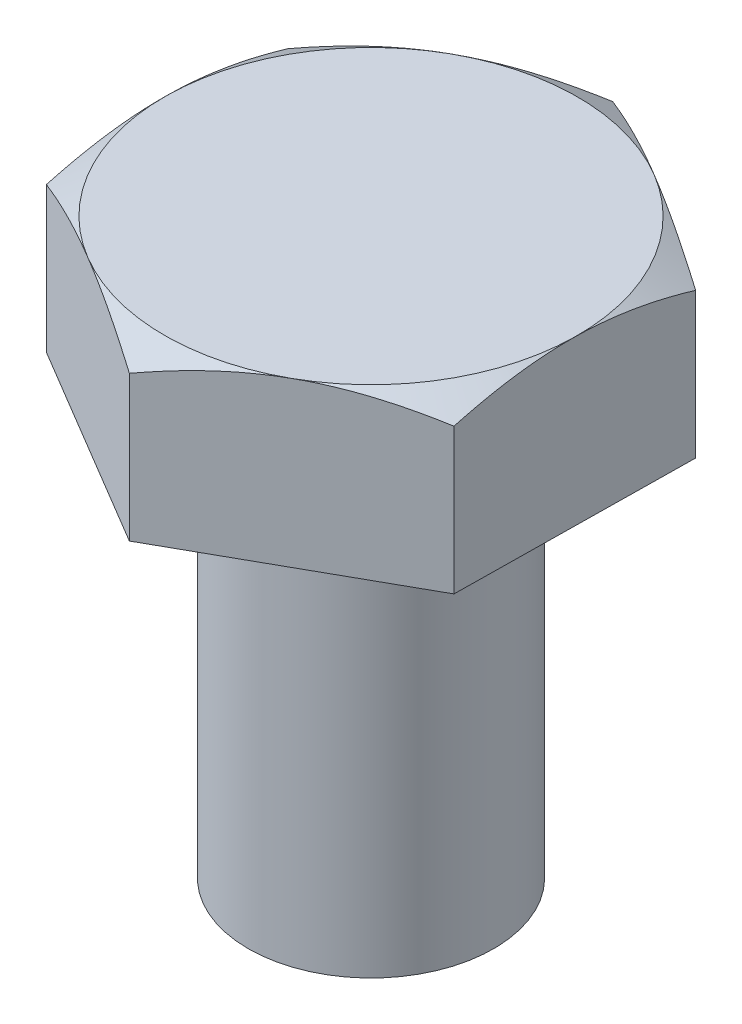
ISO-10303-21;
HEADER;
FILE_DESCRIPTION(('STEP AP214'),'2;1');
FILE_NAME('part.step','',(''),(''),'','','');
FILE_SCHEMA(('AUTOMOTIVE_DESIGN { 1 0 10303 214 1 1 1 1 }'));
ENDSEC;
DATA;
#1=APPLICATION_CONTEXT('core data for automotive mechanical design processes');
#2=APPLICATION_PROTOCOL_DEFINITION('international standard','automotive_design',2000,#1);
#3=PRODUCT_CONTEXT('',#1,'mechanical');
#4=PRODUCT('Part','Part','',(#3));
#5=PRODUCT_RELATED_PRODUCT_CATEGORY('part','',(#4));
#6=PRODUCT_DEFINITION_FORMATION('','',#4);
#7=PRODUCT_DEFINITION_CONTEXT('part definition',#1,'design');
#8=PRODUCT_DEFINITION('design','',#6,#7);
#9=PRODUCT_DEFINITION_SHAPE('','',#8);
#10=(LENGTH_UNIT() NAMED_UNIT(*) SI_UNIT(.MILLI.,.METRE.));
#11=(NAMED_UNIT(*) PLANE_ANGLE_UNIT() SI_UNIT($,.RADIAN.));
#12=(NAMED_UNIT(*) SI_UNIT($,.STERADIAN.) SOLID_ANGLE_UNIT());
#13=UNCERTAINTY_MEASURE_WITH_UNIT(LENGTH_MEASURE(1.E-05),#10,'distance_accuracy_value','');
#14=(GEOMETRIC_REPRESENTATION_CONTEXT(3) GLOBAL_UNCERTAINTY_ASSIGNED_CONTEXT((#13)) GLOBAL_UNIT_ASSIGNED_CONTEXT((#10,
#11,#12)) REPRESENTATION_CONTEXT('',''));
#15=CARTESIAN_POINT('',(0.,0.,0.));
#16=DIRECTION('',(0.,0.,1.));
#17=DIRECTION('',(1.,0.,0.));
#18=AXIS2_PLACEMENT_3D('',#15,#16,#17);
#19=CARTESIAN_POINT('',(5.00722219873248,4.,2.97979122709562));
#20=DIRECTION('',(-0.999912762362187,0.,-0.0132086208674446));
#21=DIRECTION('',(-0.0132086208674446,0.,0.999912762362187));
#22=AXIS2_PLACEMENT_3D('',#19,#20,#21);
#23=PLANE('',#22);
#24=CARTESIAN_POINT('',(5.00721955677783,3.54923882725601,2.97999122709562));
#25=CARTESIAN_POINT('',(5.0106018713427,3.62317625761294,2.72394485149891));
#26=CARTESIAN_POINT('',(5.01401311494337,3.6904256384554,2.46570850373315));
#27=CARTESIAN_POINT('',(5.02089467007304,3.80780967223275,1.94476427586024));
#28=CARTESIAN_POINT('',(5.02436510386321,3.85790280244813,1.68204714039622));
#29=CARTESIAN_POINT('',(5.03126349109287,3.93586600732761,1.15982869686023));
#30=CARTESIAN_POINT('',(5.03469037024859,3.96425538917167,0.900408713709201));
#31=CARTESIAN_POINT('',(5.03984274276313,3.98971237358388,0.510366249364661));
#32=CARTESIAN_POINT('',(5.04156137554895,3.99534492916305,0.380263124019757));
#33=CARTESIAN_POINT('',(5.04500022916478,4.00080530244156,0.119936655959088));
#34=CARTESIAN_POINT('',(5.04672044994411,4.00063329945253,-0.0102866829188294));
#35=CARTESIAN_POINT('',(5.0514333173754,3.9921736525103,-0.367057941565455));
#36=CARTESIAN_POINT('',(5.05442440222253,3.97796744660525,-0.593487630324349));
#37=CARTESIAN_POINT('',(5.06038672049818,3.9329204566082,-1.04484422515133));
#38=CARTESIAN_POINT('',(5.06335793297095,3.90206427548076,-1.26976954483678));
#39=CARTESIAN_POINT('',(5.06933226283884,3.82493213650279,-1.72203543553117));
#40=CARTESIAN_POINT('',(5.07233462626794,3.77832935873631,-1.94931893016198));
#41=CARTESIAN_POINT('',(5.07829457835972,3.67255974721504,-2.40049640125811));
#42=CARTESIAN_POINT('',(5.08125224335487,3.61341775968805,-2.62439615620808));
#43=CARTESIAN_POINT('',(5.08418864195971,3.54923882725601,-2.84668601294789));
#44=B_SPLINE_CURVE_WITH_KNOTS('',3,(#24,#25,#26,#27,#28,#29,#30,#31,#32,#33,#34,#35,#36,#37,#38,
#39,#40,#41,#42,#43),.UNSPECIFIED.,.F.,.F.,(4,2,2,2,2,2,2,2,2,4),(0.,0.799867967077852,
1.60165837020833,2.38360560899009,2.77420178768719,3.16478590028611,3.84475883245437,
4.52536164872997,5.22105970461848,5.91539191921314),.UNSPECIFIED.);
#45=CARTESIAN_POINT('',(5.00722219873248,3.54929656880656,2.97979122709562));
#46=VERTEX_POINT('',#45);
#47=CARTESIAN_POINT('',(5.04570409936877,4.,0.0666526070738682));
#48=VERTEX_POINT('',#47);
#49=EDGE_CURVE('E131',#46,#48,#44,.T.);
#50=ORIENTED_EDGE('',*,*,#49,.F.);
#51=DIRECTION('',(0.,-1.,0.));
#52=VECTOR('',#51,1.);
#53=CARTESIAN_POINT('',(5.00722219873248,4.,2.97979122709562));
#54=LINE('',#53,#52);
#55=CARTESIAN_POINT('',(5.00722219873248,0.,2.97979122709562));
#56=VERTEX_POINT('',#55);
#57=EDGE_CURVE('E80',#46,#56,#54,.T.);
#58=ORIENTED_EDGE('',*,*,#57,.T.);
#59=DIRECTION('',(0.0132086208674446,0.,-0.999912762362187));
#60=VECTOR('',#59,1.);
#61=CARTESIAN_POINT('',(5.00722219873248,0.,2.97979122709562));
#62=LINE('',#61,#60);
#63=CARTESIAN_POINT('',(5.08418600000506,0.,-2.84648601294789));
#64=VERTEX_POINT('',#63);
#65=EDGE_CURVE('E138',#56,#64,#62,.T.);
#66=ORIENTED_EDGE('',*,*,#65,.T.);
#67=DIRECTION('',(0.,-1.,0.));
#68=VECTOR('',#67,1.);
#69=CARTESIAN_POINT('',(5.08418600000506,4.,-2.84648601294789));
#70=LINE('',#69,#68);
#71=CARTESIAN_POINT('',(5.08418600000506,3.54929656880656,-2.84648601294789));
#72=VERTEX_POINT('',#71);
#73=EDGE_CURVE('E151',#72,#64,#70,.T.);
#74=ORIENTED_EDGE('',*,*,#73,.F.);
#75=EDGE_CURVE('E139',#48,#72,#44,.T.);
#76=ORIENTED_EDGE('',*,*,#75,.F.);
#77=EDGE_LOOP('',(#50,#58,#66,#74,#76));
#78=FACE_BOUND('',#77,.T.);
#79=ADVANCED_FACE('F57',(#78),#23,.F.);
#80=CARTESIAN_POINT('',(5.08418600000506,4.,-2.84648601294789));
#81=DIRECTION('',(-0.511395382401258,0.,0.859345543340204));
#82=DIRECTION('',(0.859345543340204,0.,0.511395382401258));
#83=AXIS2_PLACEMENT_3D('',#80,#81,#82);
#84=PLANE('',#83);
#85=CARTESIAN_POINT('',(5.08438600000505,3.54922938191429,-2.84636699321563));
#86=CARTESIAN_POINT('',(4.86433401697332,3.62316758810579,-2.97731963372536));
#87=CARTESIAN_POINT('',(4.64239992389016,3.69041779288756,-3.10939231540704));
#88=CARTESIAN_POINT('',(4.19468876414299,3.8078035367464,-3.37582462720362));
#89=CARTESIAN_POINT('',(3.96890374293109,3.85789755202862,-3.51018899105932));
#90=CARTESIAN_POINT('',(3.52009746927582,3.93586250686594,-3.77727300367653));
#91=CARTESIAN_POINT('',(3.29714611123834,3.96425275893736,-3.90995105837067));
#92=CARTESIAN_POINT('',(2.96193481654687,3.98971100457903,-4.1094348510807));
#93=CARTESIAN_POINT('',(2.85012124936968,3.99534397306831,-4.17597495521852));
#94=CARTESIAN_POINT('',(2.62639078218027,4.00080514747322,-4.30911665672595));
#95=CARTESIAN_POINT('',(2.51447388546661,4.00063353268802,-4.37571825213259));
#96=CARTESIAN_POINT('',(2.20785288988493,3.99217479922327,-4.55818799611736));
#97=CARTESIAN_POINT('',(2.01325039148761,3.9779687507373,-4.67399568239141));
#98=CARTESIAN_POINT('',(1.62533695142715,3.93292133513721,-4.90484245125603));
#99=CARTESIAN_POINT('',(1.43202737326934,3.90206456929602,-5.01988072242643));
#100=CARTESIAN_POINT('',(1.04333238172182,3.82493060521689,-5.25119259153471));
#101=CARTESIAN_POINT('',(0.847996024613632,3.77832656358658,-5.36743699614515));
#102=CARTESIAN_POINT('',(0.460236476354764,3.67255394409794,-5.59819218420467));
#103=CARTESIAN_POINT('',(0.267808318546457,3.61341021485302,-5.71270592330507));
#104=CARTESIAN_POINT('',(0.0767638012725782,3.54922938191429,-5.82639625977576));
#105=B_SPLINE_CURVE_WITH_KNOTS('',3,(#85,#86,#87,#88,#89,#90,#91,#92,#93,#94,#95,#96,#97,#98,
#99,#100,#101,#102,#103,#104),.UNSPECIFIED.,.F.,.F.,(4,2,2,2,2,2,2,2,2,4),(0.,0.799870207319984,
1.6016629120415,2.38361217700529,2.77420935673546,3.16479447122592,3.8447818822245,
4.5253992319138,5.2211125902274,5.91545999872994),.UNSPECIFIED.);
#106=CARTESIAN_POINT('',(2.58057490063882,4.,-4.3363816264957));
#107=VERTEX_POINT('',#106);
#108=EDGE_CURVE('E144',#72,#107,#105,.T.);
#109=ORIENTED_EDGE('',*,*,#108,.F.);
#110=ORIENTED_EDGE('',*,*,#73,.T.);
#111=DIRECTION('',(-0.859345543340204,0.,-0.511395382401258));
#112=VECTOR('',#111,1.);
#113=CARTESIAN_POINT('',(5.08418600000506,0.,-2.84648601294789));
#114=LINE('',#113,#112);
#115=CARTESIAN_POINT('',(0.0769638012725778,0.,-5.82627724004351));
#116=VERTEX_POINT('',#115);
#117=EDGE_CURVE('E266',#64,#116,#114,.T.);
#118=ORIENTED_EDGE('',*,*,#117,.T.);
#119=DIRECTION('',(0.,-1.,0.));
#120=VECTOR('',#119,1.);
#121=CARTESIAN_POINT('',(0.0769638012725778,4.,-5.82627724004351));
#122=LINE('',#121,#120);
#123=CARTESIAN_POINT('',(0.0769638012725779,3.54929656880656,-5.82627724004351));
#124=VERTEX_POINT('',#123);
#125=EDGE_CURVE('E214',#124,#116,#122,.T.);
#126=ORIENTED_EDGE('',*,*,#125,.F.);
#127=EDGE_CURVE('E152',#107,#124,#105,.T.);
#128=ORIENTED_EDGE('',*,*,#127,.F.);
#129=EDGE_LOOP('',(#109,#110,#118,#126,#128));
#130=FACE_BOUND('',#129,.T.);
#131=ADVANCED_FACE('F202',(#130),#84,.F.);
#132=CARTESIAN_POINT('',(0.0769638012725778,4.,-5.82627724004351));
#133=DIRECTION('',(0.488517379960929,0.,0.872554164207649));
#134=DIRECTION('',(0.872554164207649,0.,-0.488517379960929));
#135=AXIS2_PLACEMENT_3D('',#132,#133,#134);
#136=PLANE('',#135);
#137=CARTESIAN_POINT('',(0.077163801272578,3.54923039901146,-5.82638921415354));
#138=CARTESIAN_POINT('',(-0.146270451736622,3.62316852165958,-5.70129495599628));
#139=CARTESIAN_POINT('',(-0.371615743547656,3.69041863771798,-5.57513076349366));
#140=CARTESIAN_POINT('',(-0.826208364267812,3.80780419743189,-5.32061774283156));
#141=CARTESIAN_POINT('',(-1.0554637699574,3.85789811740837,-5.19226439272056));
#142=CARTESIAN_POINT('',(-1.51116833416514,3.93586288380672,-4.93712882764632));
#143=CARTESIAN_POINT('',(-1.73754652419101,3.96425304217028,-4.8103863458519));
#144=CARTESIAN_POINT('',(-2.07791011638596,3.98971115200013,-4.61982679423465));
#145=CARTESIAN_POINT('',(-2.19144229079848,3.99534407602637,-4.55626347328525));
#146=CARTESIAN_POINT('',(-2.41861155904063,4.00080516416427,-4.42907809009465));
#147=CARTESIAN_POINT('',(-2.53224864952103,4.00063350757643,-4.3654560297286));
#148=CARTESIAN_POINT('',(-2.84358209382204,3.99217467574521,-4.19114960298402));
#149=CARTESIAN_POINT('',(-3.04117528445698,3.97796861030707,-4.08052299463501));
#150=CARTESIAN_POINT('',(-3.43505026081183,3.93292124053565,-3.86000399492824));
#151=CARTESIAN_POINT('',(-3.6313306620834,3.90206453765746,-3.75011237868234));
#152=CARTESIAN_POINT('',(-4.02599919362766,3.8249307701092,-3.5291490907951));
#153=CARTESIAN_POINT('',(-4.22433751399779,3.7783268645748,-3.4181053062513));
#154=CARTESIAN_POINT('',(-4.61805622759276,3.67255456899146,-3.19767379346188));
#155=CARTESIAN_POINT('',(-4.81344166375983,3.61341102729903,-3.08828324182141));
#156=CARTESIAN_POINT('',(-5.00742219873248,3.54923039901146,-2.97967925298559));
#157=B_SPLINE_CURVE_WITH_KNOTS('',3,(#137,#138,#139,#140,#141,#142,#143,#144,#145,#146,#147,
#148,#149,#150,#151,#152,#153,#154,#155,#156),.UNSPECIFIED.,.F.,.F.,(4,2,2,2,2,2,2,2,2,4),(0.,
0.799869966085366,1.60166242296607,2.38361146974568,2.77420854168219,3.16479354828656,
3.84477940017653,4.52539518487944,5.22110689539691,5.91545266778893),.UNSPECIFIED.);
#158=CARTESIAN_POINT('',(-2.46512919872995,4.,-4.40303423356957));
#159=VERTEX_POINT('',#158);
#160=EDGE_CURVE('E196',#124,#159,#157,.T.);
#161=ORIENTED_EDGE('',*,*,#160,.F.);
#162=ORIENTED_EDGE('',*,*,#125,.T.);
#163=DIRECTION('',(-0.872554164207649,0.,0.488517379960929));
#164=VECTOR('',#163,1.);
#165=CARTESIAN_POINT('',(0.0769638012725778,0.,-5.82627724004351));
#166=LINE('',#165,#164);
#167=CARTESIAN_POINT('',(-5.00722219873248,0.,-2.97979122709562));
#168=VERTEX_POINT('',#167);
#169=EDGE_CURVE('E232',#116,#168,#166,.T.);
#170=ORIENTED_EDGE('',*,*,#169,.T.);
#171=DIRECTION('',(0.,-1.,0.));
#172=VECTOR('',#171,1.);
#173=CARTESIAN_POINT('',(-5.00722219873248,4.,-2.97979122709562));
#174=LINE('',#173,#172);
#175=CARTESIAN_POINT('',(-5.00722219873248,3.54929656880656,-2.97979122709562));
#176=VERTEX_POINT('',#175);
#177=EDGE_CURVE('E230',#176,#168,#174,.T.);
#178=ORIENTED_EDGE('',*,*,#177,.F.);
#179=EDGE_CURVE('E191',#159,#176,#157,.T.);
#180=ORIENTED_EDGE('',*,*,#179,.F.);
#181=EDGE_LOOP('',(#161,#162,#170,#178,#180));
#182=FACE_BOUND('',#181,.T.);
#183=ADVANCED_FACE('F198',(#182),#136,.F.);
#184=CARTESIAN_POINT('',(-5.00722219873248,4.,-2.97979122709562));
#185=DIRECTION('',(0.999912762362187,0.,0.0132086208674447));
#186=DIRECTION('',(0.0132086208674447,0.,-0.999912762362187));
#187=AXIS2_PLACEMENT_3D('',#184,#185,#186);
#188=PLANE('',#187);
#189=CARTESIAN_POINT('',(-5.00721955677782,3.54923882725601,-2.97999122709563));
#190=CARTESIAN_POINT('',(-5.0106018713427,3.62317625761294,-2.72394485149892));
#191=CARTESIAN_POINT('',(-5.01401311494336,3.6904256384554,-2.46570850373315));
#192=CARTESIAN_POINT('',(-5.02089467007303,3.80780967223275,-1.94476427586024));
#193=CARTESIAN_POINT('',(-5.02436510386321,3.85790280244814,-1.68204714039622));
#194=CARTESIAN_POINT('',(-5.03126349109287,3.93586600732761,-1.15982869686023));
#195=CARTESIAN_POINT('',(-5.03469037024859,3.96425538917167,-0.900408713709202));
#196=CARTESIAN_POINT('',(-5.03984274276313,3.98971237358389,-0.510366249364662));
#197=CARTESIAN_POINT('',(-5.04156137554894,3.99534492916305,-0.380263124019759));
#198=CARTESIAN_POINT('',(-5.04500022916478,4.00080530244156,-0.119936655959089));
#199=CARTESIAN_POINT('',(-5.04672044994411,4.00063329945253,0.0102866829188279));
#200=CARTESIAN_POINT('',(-5.0514333173754,3.9921736525103,0.367057941565454));
#201=CARTESIAN_POINT('',(-5.05442440222252,3.97796744660525,0.593487630324348));
#202=CARTESIAN_POINT('',(-5.06038672049818,3.9329204566082,1.04484422515133));
#203=CARTESIAN_POINT('',(-5.06335793297095,3.90206427548077,1.26976954483678));
#204=CARTESIAN_POINT('',(-5.06933226283883,3.82493213650279,1.72203543553117));
#205=CARTESIAN_POINT('',(-5.07233462626793,3.77832935873631,1.94931893016198));
#206=CARTESIAN_POINT('',(-5.07829457835972,3.67255974721504,2.40049640125811));
#207=CARTESIAN_POINT('',(-5.08125224335487,3.61341775968805,2.62439615620808));
#208=CARTESIAN_POINT('',(-5.08418864195971,3.54923882725601,2.84668601294789));
#209=B_SPLINE_CURVE_WITH_KNOTS('',3,(#189,#190,#191,#192,#193,#194,#195,#196,#197,#198,#199,
#200,#201,#202,#203,#204,#205,#206,#207,#208),.UNSPECIFIED.,.F.,.F.,(4,2,2,2,2,2,2,2,2,4),(0.,
0.799867967077851,1.60165837020833,2.38360560899009,2.77420178768719,3.16478590028611,
3.84475883245437,4.52536164872997,5.22105970461848,5.91539191921314),.UNSPECIFIED.);
#210=CARTESIAN_POINT('',(-5.04570409936877,4.,-0.0666526070738689));
#211=VERTEX_POINT('',#210);
#212=EDGE_CURVE('E197',#176,#211,#209,.T.);
#213=ORIENTED_EDGE('',*,*,#212,.F.);
#214=ORIENTED_EDGE('',*,*,#177,.T.);
#215=DIRECTION('',(-0.0132086208674447,0.,0.999912762362187));
#216=VECTOR('',#215,1.);
#217=CARTESIAN_POINT('',(-5.00722219873248,0.,-2.97979122709562));
#218=LINE('',#217,#216);
#219=CARTESIAN_POINT('',(-5.08418600000505,0.,2.84648601294789));
#220=VERTEX_POINT('',#219);
#221=EDGE_CURVE('E264',#168,#220,#218,.T.);
#222=ORIENTED_EDGE('',*,*,#221,.T.);
#223=DIRECTION('',(0.,-1.,0.));
#224=VECTOR('',#223,1.);
#225=CARTESIAN_POINT('',(-5.08418600000505,4.,2.84648601294789));
#226=LINE('',#225,#224);
#227=CARTESIAN_POINT('',(-5.08418600000505,3.54929656880656,2.84648601294789));
#228=VERTEX_POINT('',#227);
#229=EDGE_CURVE('E236',#228,#220,#226,.T.);
#230=ORIENTED_EDGE('',*,*,#229,.F.);
#231=EDGE_CURVE('E186',#211,#228,#209,.T.);
#232=ORIENTED_EDGE('',*,*,#231,.F.);
#233=EDGE_LOOP('',(#213,#214,#222,#230,#232));
#234=FACE_BOUND('',#233,.T.);
#235=ADVANCED_FACE('F201',(#234),#188,.F.);
#236=CARTESIAN_POINT('',(-5.08418600000505,4.,2.84648601294789));
#237=DIRECTION('',(0.511395382401258,0.,-0.859345543340205));
#238=DIRECTION('',(-0.859345543340204,0.,-0.511395382401258));
#239=AXIS2_PLACEMENT_3D('',#236,#237,#238);
#240=PLANE('',#239);
#241=CARTESIAN_POINT('',(-5.08438600000505,3.54922938191429,2.84636699321563));
#242=CARTESIAN_POINT('',(-4.86433401697332,3.62316758810579,2.97731963372536));
#243=CARTESIAN_POINT('',(-4.64239992389016,3.69041779288756,3.10939231540704));
#244=CARTESIAN_POINT('',(-4.19468876414299,3.8078035367464,3.37582462720362));
#245=CARTESIAN_POINT('',(-3.96890374293108,3.85789755202862,3.51018899105932));
#246=CARTESIAN_POINT('',(-3.52009746927582,3.93586250686594,3.77727300367653));
#247=CARTESIAN_POINT('',(-3.29714611123834,3.96425275893736,3.90995105837067));
#248=CARTESIAN_POINT('',(-2.96193481654687,3.98971100457903,4.1094348510807));
#249=CARTESIAN_POINT('',(-2.85012124936967,3.99534397306831,4.17597495521852));
#250=CARTESIAN_POINT('',(-2.62639078218027,4.00080514747322,4.30911665672595));
#251=CARTESIAN_POINT('',(-2.51447388546661,4.00063353268802,4.37571825213259));
#252=CARTESIAN_POINT('',(-2.20785288988493,3.99217479922327,4.55818799611736));
#253=CARTESIAN_POINT('',(-2.01325039148761,3.9779687507373,4.67399568239141));
#254=CARTESIAN_POINT('',(-1.62533695142715,3.93292133513721,4.90484245125604));
#255=CARTESIAN_POINT('',(-1.43202737326934,3.90206456929602,5.01988072242643));
#256=CARTESIAN_POINT('',(-1.04333238172182,3.82493060521689,5.25119259153471));
#257=CARTESIAN_POINT('',(-0.847996024613629,3.77832656358658,5.36743699614515));
#258=CARTESIAN_POINT('',(-0.46023647635476,3.67255394409794,5.59819218420467));
#259=CARTESIAN_POINT('',(-0.267808318546453,3.61341021485302,5.71270592330507));
#260=CARTESIAN_POINT('',(-0.0767638012725743,3.54922938191429,5.82639625977576));
#261=B_SPLINE_CURVE_WITH_KNOTS('',3,(#241,#242,#243,#244,#245,#246,#247,#248,#249,#250,#251,
#252,#253,#254,#255,#256,#257,#258,#259,#260),.UNSPECIFIED.,.F.,.F.,(4,2,2,2,2,2,2,2,2,4),(0.,
0.799870207319983,1.6016629120415,2.38361217700529,2.77420935673546,3.16479447122592,
3.84478188222451,4.5253992319138,5.2211125902274,5.91545999872994),.UNSPECIFIED.);
#262=CARTESIAN_POINT('',(-2.58057490063882,4.,4.3363816264957));
#263=VERTEX_POINT('',#262);
#264=EDGE_CURVE('E248',#228,#263,#261,.T.);
#265=ORIENTED_EDGE('',*,*,#264,.F.);
#266=ORIENTED_EDGE('',*,*,#229,.T.);
#267=DIRECTION('',(0.859345543340204,0.,0.511395382401258));
#268=VECTOR('',#267,1.);
#269=CARTESIAN_POINT('',(-5.08418600000505,0.,2.84648601294789));
#270=LINE('',#269,#268);
#271=CARTESIAN_POINT('',(-0.076963801272574,0.,5.82627724004351));
#272=VERTEX_POINT('',#271);
#273=EDGE_CURVE('E260',#220,#272,#270,.T.);
#274=ORIENTED_EDGE('',*,*,#273,.T.);
#275=DIRECTION('',(0.,-1.,0.));
#276=VECTOR('',#275,1.);
#277=CARTESIAN_POINT('',(-0.076963801272574,4.,5.82627724004351));
#278=LINE('',#277,#276);
#279=CARTESIAN_POINT('',(-0.076963801272574,3.54929656880656,5.82627724004351));
#280=VERTEX_POINT('',#279);
#281=EDGE_CURVE('E239',#280,#272,#278,.T.);
#282=ORIENTED_EDGE('',*,*,#281,.F.);
#283=EDGE_CURVE('E180',#263,#280,#261,.T.);
#284=ORIENTED_EDGE('',*,*,#283,.F.);
#285=EDGE_LOOP('',(#265,#266,#274,#282,#284));
#286=FACE_BOUND('',#285,.T.);
#287=ADVANCED_FACE('F247',(#286),#240,.F.);
#288=CARTESIAN_POINT('',(-0.076963801272574,4.,5.82627724004351));
#289=DIRECTION('',(-0.488517379960929,0.,-0.872554164207649));
#290=DIRECTION('',(-0.872554164207649,0.,0.488517379960929));
#291=AXIS2_PLACEMENT_3D('',#288,#289,#290);
#292=PLANE('',#291);
#293=CARTESIAN_POINT('',(-0.0771638012725741,3.54923039901146,5.82638921415354));
#294=CARTESIAN_POINT('',(0.146270451736626,3.62316852165958,5.70129495599628));
#295=CARTESIAN_POINT('',(0.37161574354766,3.69041863771797,5.57513076349366));
#296=CARTESIAN_POINT('',(0.826208364267817,3.80780419743189,5.32061774283156));
#297=CARTESIAN_POINT('',(1.0554637699574,3.85789811740837,5.19226439272056));
#298=CARTESIAN_POINT('',(1.51116833416515,3.93586288380672,4.93712882764632));
#299=CARTESIAN_POINT('',(1.73754652419101,3.96425304217028,4.8103863458519));
#300=CARTESIAN_POINT('',(2.07791011638596,3.98971115200013,4.61982679423465));
#301=CARTESIAN_POINT('',(2.19144229079848,3.99534407602637,4.55626347328525));
#302=CARTESIAN_POINT('',(2.41861155904064,4.00080516416427,4.42907809009465));
#303=CARTESIAN_POINT('',(2.53224864952104,4.00063350757643,4.3654560297286));
#304=CARTESIAN_POINT('',(2.84358209382205,3.99217467574521,4.19114960298402));
#305=CARTESIAN_POINT('',(3.04117528445698,3.97796861030707,4.08052299463501));
#306=CARTESIAN_POINT('',(3.43505026081183,3.93292124053565,3.86000399492824));
#307=CARTESIAN_POINT('',(3.6313306620834,3.90206453765746,3.75011237868234));
#308=CARTESIAN_POINT('',(4.02599919362766,3.8249307701092,3.5291490907951));
#309=CARTESIAN_POINT('',(4.22433751399779,3.7783268645748,3.4181053062513));
#310=CARTESIAN_POINT('',(4.61805622759276,3.67255456899146,3.19767379346188));
#311=CARTESIAN_POINT('',(4.81344166375983,3.61341102729903,3.08828324182141));
#312=CARTESIAN_POINT('',(5.00742219873248,3.54923039901146,2.97967925298559));
#313=B_SPLINE_CURVE_WITH_KNOTS('',3,(#293,#294,#295,#296,#297,#298,#299,#300,#301,#302,#303,
#304,#305,#306,#307,#308,#309,#310,#311,#312),.UNSPECIFIED.,.F.,.F.,(4,2,2,2,2,2,2,2,2,4),(0.,
0.799869966085366,1.60166242296607,2.38361146974568,2.77420854168219,3.16479354828656,
3.84477940017653,4.52539518487943,5.22110689539691,5.91545266778893),.UNSPECIFIED.);
#314=CARTESIAN_POINT('',(2.46512919872995,4.,4.40303423356957));
#315=VERTEX_POINT('',#314);
#316=EDGE_CURVE('E253',#280,#315,#313,.T.);
#317=ORIENTED_EDGE('',*,*,#316,.F.);
#318=ORIENTED_EDGE('',*,*,#281,.T.);
#319=DIRECTION('',(0.872554164207649,0.,-0.488517379960929));
#320=VECTOR('',#319,1.);
#321=CARTESIAN_POINT('',(-0.076963801272574,0.,5.82627724004351));
#322=LINE('',#321,#320);
#323=EDGE_CURVE('E257',#272,#56,#322,.T.);
#324=ORIENTED_EDGE('',*,*,#323,.T.);
#325=ORIENTED_EDGE('',*,*,#57,.F.);
#326=EDGE_CURVE('E136',#315,#46,#313,.T.);
#327=ORIENTED_EDGE('',*,*,#326,.F.);
#328=EDGE_LOOP('',(#317,#318,#324,#325,#327));
#329=FACE_BOUND('',#328,.T.);
#330=ADVANCED_FACE('F255',(#329),#292,.F.);
#331=CARTESIAN_POINT('',(0.,0.,0.));
#332=DIRECTION('',(0.,1.,0.));
#333=DIRECTION('',(0.,0.,1.));
#334=AXIS2_PLACEMENT_3D('',#331,#332,#333);
#335=PLANE('',#334);
#336=ORIENTED_EDGE('',*,*,#65,.F.);
#337=ORIENTED_EDGE('',*,*,#323,.F.);
#338=ORIENTED_EDGE('',*,*,#273,.F.);
#339=ORIENTED_EDGE('',*,*,#221,.F.);
#340=ORIENTED_EDGE('',*,*,#169,.F.);
#341=ORIENTED_EDGE('',*,*,#117,.F.);
#342=EDGE_LOOP('',(#336,#337,#338,#339,#340,#341));
#343=FACE_BOUND('',#342,.T.);
#344=ADVANCED_FACE('F268',(#343),#335,.F.);
#345=CARTESIAN_POINT('',(0.,4.,0.));
#346=DIRECTION('',(0.,-1.,0.));
#347=DIRECTION('',(0.,0.,1.));
#348=AXIS2_PLACEMENT_3D('',#345,#346,#347);
#349=CONICAL_SURFACE('',#348,5.0461443130787,1.0471975511966);
#350=ORIENTED_EDGE('',*,*,#283,.T.);
#351=ORIENTED_EDGE('',*,*,#316,.T.);
#352=CARTESIAN_POINT('',(0.,4.,0.));
#353=DIRECTION('',(0.,1.,0.));
#354=DIRECTION('',(0.,0.,1.));
#355=AXIS2_PLACEMENT_3D('',#352,#353,#354);
#356=CIRCLE('',#355,5.0461443130787);
#357=EDGE_CURVE('E61',#263,#315,#356,.T.);
#358=ORIENTED_EDGE('',*,*,#357,.F.);
#359=EDGE_LOOP('',(#350,#351,#358));
#360=FACE_BOUND('',#359,.T.);
#361=ADVANCED_FACE('F167',(#360),#349,.T.);
#362=ORIENTED_EDGE('',*,*,#231,.T.);
#363=ORIENTED_EDGE('',*,*,#264,.T.);
#364=EDGE_CURVE('E227',#211,#263,#356,.T.);
#365=ORIENTED_EDGE('',*,*,#364,.F.);
#366=EDGE_LOOP('',(#362,#363,#365));
#367=FACE_BOUND('',#366,.T.);
#368=ADVANCED_FACE('F270',(#367),#349,.T.);
#369=ORIENTED_EDGE('',*,*,#179,.T.);
#370=ORIENTED_EDGE('',*,*,#212,.T.);
#371=EDGE_CURVE('E222',#159,#211,#356,.T.);
#372=ORIENTED_EDGE('',*,*,#371,.F.);
#373=EDGE_LOOP('',(#369,#370,#372));
#374=FACE_BOUND('',#373,.T.);
#375=ADVANCED_FACE('F223',(#374),#349,.T.);
#376=ORIENTED_EDGE('',*,*,#127,.T.);
#377=ORIENTED_EDGE('',*,*,#160,.T.);
#378=EDGE_CURVE('E66',#107,#159,#356,.T.);
#379=ORIENTED_EDGE('',*,*,#378,.F.);
#380=EDGE_LOOP('',(#376,#377,#379));
#381=FACE_BOUND('',#380,.T.);
#382=ADVANCED_FACE('F218',(#381),#349,.T.);
#383=ORIENTED_EDGE('',*,*,#75,.T.);
#384=ORIENTED_EDGE('',*,*,#108,.T.);
#385=EDGE_CURVE('E14',#48,#107,#356,.T.);
#386=ORIENTED_EDGE('',*,*,#385,.F.);
#387=EDGE_LOOP('',(#383,#384,#386));
#388=FACE_BOUND('',#387,.T.);
#389=ADVANCED_FACE('F142',(#388),#349,.T.);
#390=ORIENTED_EDGE('',*,*,#49,.T.);
#391=CARTESIAN_POINT('',(0.,4.,0.));
#392=DIRECTION('',(0.,1.,0.));
#393=DIRECTION('',(0.,0.,1.));
#394=AXIS2_PLACEMENT_3D('',#391,#392,#393);
#395=CIRCLE('',#394,5.0461443130787);
#396=EDGE_CURVE('E134',#315,#48,#395,.T.);
#397=ORIENTED_EDGE('',*,*,#396,.F.);
#398=ORIENTED_EDGE('',*,*,#326,.T.);
#399=EDGE_LOOP('',(#390,#397,#398));
#400=FACE_BOUND('',#399,.T.);
#401=ADVANCED_FACE('F133',(#400),#349,.T.);
#402=CARTESIAN_POINT('',(0.,4.,0.));
#403=DIRECTION('',(0.,1.,0.));
#404=DIRECTION('',(0.,0.,1.));
#405=AXIS2_PLACEMENT_3D('',#402,#403,#404);
#406=PLANE('',#405);
#407=ORIENTED_EDGE('',*,*,#357,.T.);
#408=ORIENTED_EDGE('',*,*,#396,.T.);
#409=ORIENTED_EDGE('',*,*,#385,.T.);
#410=ORIENTED_EDGE('',*,*,#378,.T.);
#411=ORIENTED_EDGE('',*,*,#371,.T.);
#412=ORIENTED_EDGE('',*,*,#364,.T.);
#413=EDGE_LOOP('',(#407,#408,#409,#410,#411,#412));
#414=FACE_BOUND('',#413,.T.);
#415=ADVANCED_FACE('F148',(#414),#406,.T.);
#416=CLOSED_SHELL('',(#79,#131,#183,#235,#287,#330,#344,#361,#368,#375,#382,#389,#401,#415));
#417=MANIFOLD_SOLID_BREP('B2',#416);
#418=CARTESIAN_POINT('',(0.,-10.,0.));
#419=DIRECTION('',(0.,1.,0.));
#420=DIRECTION('',(0.,0.,1.));
#421=AXIS2_PLACEMENT_3D('',#418,#419,#420);
#422=CYLINDRICAL_SURFACE('',#421,3.);
#423=CARTESIAN_POINT('',(0.,-10.,0.));
#424=DIRECTION('',(0.,1.,0.));
#425=DIRECTION('',(0.,0.,1.));
#426=AXIS2_PLACEMENT_3D('',#423,#424,#425);
#427=CIRCLE('',#426,3.);
#428=CARTESIAN_POINT('',(0.,-10.,3.));
#429=VERTEX_POINT('',#428);
#430=EDGE_CURVE('E56',#429,#429,#427,.T.);
#431=ORIENTED_EDGE('',*,*,#430,.T.);
#432=EDGE_LOOP('',(#431));
#433=FACE_BOUND('',#432,.T.);
#434=CARTESIAN_POINT('',(0.,0.,0.));
#435=DIRECTION('',(0.,1.,0.));
#436=DIRECTION('',(0.,0.,1.));
#437=AXIS2_PLACEMENT_3D('',#434,#435,#436);
#438=CIRCLE('',#437,3.);
#439=CARTESIAN_POINT('',(0.,0.,3.));
#440=VERTEX_POINT('',#439);
#441=EDGE_CURVE('E371',#440,#440,#438,.T.);
#442=ORIENTED_EDGE('',*,*,#441,.F.);
#443=EDGE_LOOP('',(#442));
#444=FACE_BOUND('',#443,.T.);
#445=ADVANCED_FACE('F368',(#433,#444),#422,.T.);
#446=CARTESIAN_POINT('',(0.,-10.,0.));
#447=DIRECTION('',(0.,1.,0.));
#448=DIRECTION('',(0.,0.,1.));
#449=AXIS2_PLACEMENT_3D('',#446,#447,#448);
#450=PLANE('',#449);
#451=ORIENTED_EDGE('',*,*,#430,.F.);
#452=EDGE_LOOP('',(#451));
#453=FACE_BOUND('',#452,.T.);
#454=ADVANCED_FACE('F383',(#453),#450,.F.);
#455=CARTESIAN_POINT('',(0.,0.,0.));
#456=DIRECTION('',(0.,1.,0.));
#457=DIRECTION('',(0.,0.,1.));
#458=AXIS2_PLACEMENT_3D('',#455,#456,#457);
#459=PLANE('',#458);
#460=ORIENTED_EDGE('',*,*,#441,.T.);
#461=EDGE_LOOP('',(#460));
#462=FACE_BOUND('',#461,.T.);
#463=ADVANCED_FACE('F380',(#462),#459,.T.);
#464=CLOSED_SHELL('',(#445,#454,#463));
#465=MANIFOLD_SOLID_BREP('B8',#464);
#466=ADVANCED_BREP_SHAPE_REPRESENTATION('',(#18,#417,#465),#14);
#467=SHAPE_DEFINITION_REPRESENTATION(#9,#466);
ENDSEC;
END-ISO-10303-21;
